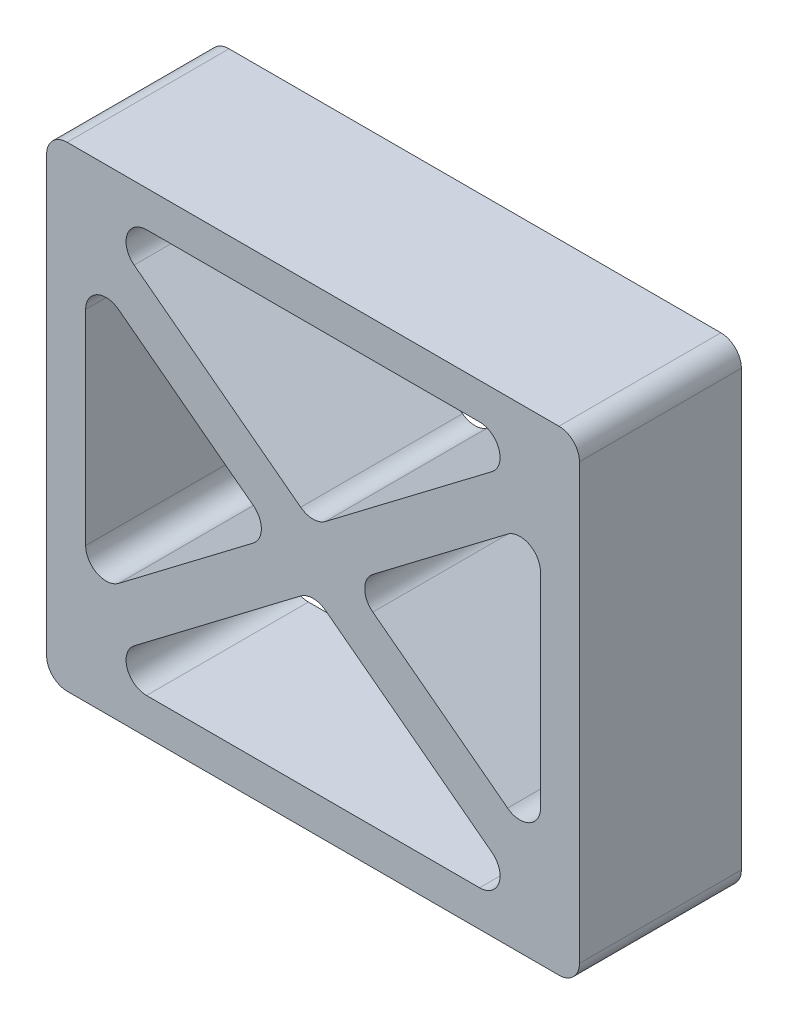
ISO-10303-21;
HEADER;
FILE_DESCRIPTION(('STEP AP214'),'2;1');
FILE_NAME('part.step','',(''),(''),'','','');
FILE_SCHEMA(('AUTOMOTIVE_DESIGN { 1 0 10303 214 1 1 1 1 }'));
ENDSEC;
DATA;
#1=APPLICATION_CONTEXT('core data for automotive mechanical design processes');
#2=APPLICATION_PROTOCOL_DEFINITION('international standard','automotive_design',2000,#1);
#3=PRODUCT_CONTEXT('',#1,'mechanical');
#4=PRODUCT('Part','Part','',(#3));
#5=PRODUCT_RELATED_PRODUCT_CATEGORY('part','',(#4));
#6=PRODUCT_DEFINITION_FORMATION('','',#4);
#7=PRODUCT_DEFINITION_CONTEXT('part definition',#1,'design');
#8=PRODUCT_DEFINITION('design','',#6,#7);
#9=PRODUCT_DEFINITION_SHAPE('','',#8);
#10=(LENGTH_UNIT() NAMED_UNIT(*) SI_UNIT(.MILLI.,.METRE.));
#11=(NAMED_UNIT(*) PLANE_ANGLE_UNIT() SI_UNIT($,.RADIAN.));
#12=(NAMED_UNIT(*) SI_UNIT($,.STERADIAN.) SOLID_ANGLE_UNIT());
#13=UNCERTAINTY_MEASURE_WITH_UNIT(LENGTH_MEASURE(1.E-05),#10,'distance_accuracy_value','');
#14=(GEOMETRIC_REPRESENTATION_CONTEXT(3) GLOBAL_UNCERTAINTY_ASSIGNED_CONTEXT((#13)) GLOBAL_UNIT_ASSIGNED_CONTEXT((#10,
#11,#12)) REPRESENTATION_CONTEXT('',''));
#15=CARTESIAN_POINT('',(0.,0.,0.));
#16=DIRECTION('',(0.,0.,1.));
#17=DIRECTION('',(1.,0.,0.));
#18=AXIS2_PLACEMENT_3D('',#15,#16,#17);
#19=CARTESIAN_POINT('',(-54.4164453565105,45.1223241590214,39.5));
#20=DIRECTION('',(1.,0.,0.));
#21=DIRECTION('',(0.,1.,0.));
#22=AXIS2_PLACEMENT_3D('',#19,#20,#21);
#23=PLANE('',#22);
#24=DIRECTION('',(0.,-1.,0.));
#25=VECTOR('',#24,1.);
#26=CARTESIAN_POINT('',(-54.4164453565105,45.1223241590214,0.));
#27=LINE('',#26,#25);
#28=CARTESIAN_POINT('',(-54.4164453565105,40.1223241590214,0.));
#29=VERTEX_POINT('',#28);
#30=CARTESIAN_POINT('',(-54.4164453565105,-65.8776758409786,0.));
#31=VERTEX_POINT('',#30);
#32=EDGE_CURVE('E315',#29,#31,#27,.T.);
#33=ORIENTED_EDGE('',*,*,#32,.T.);
#34=DIRECTION('',(0.,0.,-1.));
#35=VECTOR('',#34,1.);
#36=CARTESIAN_POINT('',(-54.4164453565105,-65.8776758409786,39.5));
#37=LINE('',#36,#35);
#38=CARTESIAN_POINT('',(-54.4164453565105,-65.8776758409786,39.5));
#39=VERTEX_POINT('',#38);
#40=EDGE_CURVE('E424',#31,#39,#37,.F.);
#41=ORIENTED_EDGE('',*,*,#40,.T.);
#42=DIRECTION('',(0.,-1.,0.));
#43=VECTOR('',#42,1.);
#44=CARTESIAN_POINT('',(-54.4164453565105,45.1223241590214,39.5));
#45=LINE('',#44,#43);
#46=CARTESIAN_POINT('',(-54.4164453565105,40.1223241590214,39.5));
#47=VERTEX_POINT('',#46);
#48=EDGE_CURVE('E323',#47,#39,#45,.T.);
#49=ORIENTED_EDGE('',*,*,#48,.F.);
#50=DIRECTION('',(0.,0.,-1.));
#51=VECTOR('',#50,1.);
#52=CARTESIAN_POINT('',(-54.4164453565105,40.1223241590214,39.5));
#53=LINE('',#52,#51);
#54=EDGE_CURVE('E421',#47,#29,#53,.T.);
#55=ORIENTED_EDGE('',*,*,#54,.T.);
#56=EDGE_LOOP('',(#33,#41,#49,#55));
#57=FACE_BOUND('',#56,.T.);
#58=ADVANCED_FACE('F38',(#57),#23,.F.);
#59=CARTESIAN_POINT('',(-54.4164453565105,-70.8776758409786,39.5));
#60=DIRECTION('',(0.,1.,0.));
#61=DIRECTION('',(0.,0.,1.));
#62=AXIS2_PLACEMENT_3D('',#59,#60,#61);
#63=PLANE('',#62);
#64=DIRECTION('',(1.,0.,0.));
#65=VECTOR('',#64,1.);
#66=CARTESIAN_POINT('',(-54.4164453565105,-70.8776758409786,0.));
#67=LINE('',#66,#65);
#68=CARTESIAN_POINT('',(-49.4164453565105,-70.8776758409786,0.));
#69=VERTEX_POINT('',#68);
#70=CARTESIAN_POINT('',(70.5835546434895,-70.8776758409786,0.));
#71=VERTEX_POINT('',#70);
#72=EDGE_CURVE('E336',#69,#71,#67,.T.);
#73=ORIENTED_EDGE('',*,*,#72,.T.);
#74=DIRECTION('',(0.,0.,-1.));
#75=VECTOR('',#74,1.);
#76=CARTESIAN_POINT('',(70.5835546434895,-70.8776758409786,39.5));
#77=LINE('',#76,#75);
#78=CARTESIAN_POINT('',(70.5835546434895,-70.8776758409786,39.5));
#79=VERTEX_POINT('',#78);
#80=EDGE_CURVE('E53',#71,#79,#77,.F.);
#81=ORIENTED_EDGE('',*,*,#80,.T.);
#82=DIRECTION('',(1.,0.,0.));
#83=VECTOR('',#82,1.);
#84=CARTESIAN_POINT('',(-54.4164453565105,-70.8776758409786,39.5));
#85=LINE('',#84,#83);
#86=CARTESIAN_POINT('',(-49.4164453565105,-70.8776758409786,39.5));
#87=VERTEX_POINT('',#86);
#88=EDGE_CURVE('E325',#87,#79,#85,.T.);
#89=ORIENTED_EDGE('',*,*,#88,.F.);
#90=DIRECTION('',(0.,0.,-1.));
#91=VECTOR('',#90,1.);
#92=CARTESIAN_POINT('',(-49.4164453565105,-70.8776758409786,39.5));
#93=LINE('',#92,#91);
#94=EDGE_CURVE('E417',#87,#69,#93,.T.);
#95=ORIENTED_EDGE('',*,*,#94,.T.);
#96=EDGE_LOOP('',(#73,#81,#89,#95));
#97=FACE_BOUND('',#96,.T.);
#98=ADVANCED_FACE('F509',(#97),#63,.F.);
#99=CARTESIAN_POINT('',(75.5835546434894,45.1223241590214,39.5));
#100=DIRECTION('',(-1.,0.,0.));
#101=DIRECTION('',(0.,-1.,0.));
#102=AXIS2_PLACEMENT_3D('',#99,#100,#101);
#103=PLANE('',#102);
#104=DIRECTION('',(0.,1.,0.));
#105=VECTOR('',#104,1.);
#106=CARTESIAN_POINT('',(75.5835546434894,45.1223241590214,0.));
#107=LINE('',#106,#105);
#108=CARTESIAN_POINT('',(75.5835546434895,-65.8776758409786,0.));
#109=VERTEX_POINT('',#108);
#110=CARTESIAN_POINT('',(75.5835546434894,40.1223241590214,0.));
#111=VERTEX_POINT('',#110);
#112=EDGE_CURVE('E338',#109,#111,#107,.T.);
#113=ORIENTED_EDGE('',*,*,#112,.T.);
#114=DIRECTION('',(0.,0.,-1.));
#115=VECTOR('',#114,1.);
#116=CARTESIAN_POINT('',(75.5835546434894,40.1223241590214,39.5));
#117=LINE('',#116,#115);
#118=CARTESIAN_POINT('',(75.5835546434894,40.1223241590214,39.5));
#119=VERTEX_POINT('',#118);
#120=EDGE_CURVE('E408',#111,#119,#117,.F.);
#121=ORIENTED_EDGE('',*,*,#120,.T.);
#122=DIRECTION('',(0.,1.,0.));
#123=VECTOR('',#122,1.);
#124=CARTESIAN_POINT('',(75.5835546434894,45.1223241590214,39.5));
#125=LINE('',#124,#123);
#126=CARTESIAN_POINT('',(75.5835546434895,-65.8776758409786,39.5));
#127=VERTEX_POINT('',#126);
#128=EDGE_CURVE('E328',#127,#119,#125,.T.);
#129=ORIENTED_EDGE('',*,*,#128,.F.);
#130=DIRECTION('',(0.,0.,-1.));
#131=VECTOR('',#130,1.);
#132=CARTESIAN_POINT('',(75.5835546434895,-65.8776758409786,39.5));
#133=LINE('',#132,#131);
#134=EDGE_CURVE('E405',#127,#109,#133,.T.);
#135=ORIENTED_EDGE('',*,*,#134,.T.);
#136=EDGE_LOOP('',(#113,#121,#129,#135));
#137=FACE_BOUND('',#136,.T.);
#138=ADVANCED_FACE('F515',(#137),#103,.F.);
#139=CARTESIAN_POINT('',(-54.4164453565105,45.1223241590214,39.5));
#140=DIRECTION('',(0.,-1.,0.));
#141=DIRECTION('',(0.,0.,-1.));
#142=AXIS2_PLACEMENT_3D('',#139,#140,#141);
#143=PLANE('',#142);
#144=DIRECTION('',(-1.,0.,0.));
#145=VECTOR('',#144,1.);
#146=CARTESIAN_POINT('',(-54.4164453565105,45.1223241590214,39.5));
#147=LINE('',#146,#145);
#148=CARTESIAN_POINT('',(70.5835546434894,45.1223241590214,39.5));
#149=VERTEX_POINT('',#148);
#150=CARTESIAN_POINT('',(-49.4164453565105,45.1223241590214,39.5));
#151=VERTEX_POINT('',#150);
#152=EDGE_CURVE('E331',#149,#151,#147,.T.);
#153=ORIENTED_EDGE('',*,*,#152,.F.);
#154=DIRECTION('',(0.,0.,-1.));
#155=VECTOR('',#154,1.);
#156=CARTESIAN_POINT('',(70.5835546434894,45.1223241590214,39.5));
#157=LINE('',#156,#155);
#158=CARTESIAN_POINT('',(70.5835546434894,45.1223241590214,0.));
#159=VERTEX_POINT('',#158);
#160=EDGE_CURVE('E394',#149,#159,#157,.T.);
#161=ORIENTED_EDGE('',*,*,#160,.T.);
#162=DIRECTION('',(-1.,0.,0.));
#163=VECTOR('',#162,1.);
#164=CARTESIAN_POINT('',(-54.4164453565105,45.1223241590214,0.));
#165=LINE('',#164,#163);
#166=CARTESIAN_POINT('',(-49.4164453565105,45.1223241590214,0.));
#167=VERTEX_POINT('',#166);
#168=EDGE_CURVE('E326',#159,#167,#165,.T.);
#169=ORIENTED_EDGE('',*,*,#168,.T.);
#170=DIRECTION('',(0.,0.,-1.));
#171=VECTOR('',#170,1.);
#172=CARTESIAN_POINT('',(-49.4164453565105,45.1223241590214,39.5));
#173=LINE('',#172,#171);
#174=EDGE_CURVE('E392',#167,#151,#173,.F.);
#175=ORIENTED_EDGE('',*,*,#174,.T.);
#176=EDGE_LOOP('',(#153,#161,#169,#175));
#177=FACE_BOUND('',#176,.T.);
#178=ADVANCED_FACE('F583',(#177),#143,.F.);
#179=CARTESIAN_POINT('',(0.,0.,39.5));
#180=DIRECTION('',(0.,0.,1.));
#181=DIRECTION('',(1.,0.,0.));
#182=AXIS2_PLACEMENT_3D('',#179,#180,#181);
#183=PLANE('',#182);
#184=DIRECTION('',(1.,0.,0.));
#185=VECTOR('',#184,1.);
#186=CARTESIAN_POINT('',(66.0688913812574,-62.0866449810001,39.5));
#187=LINE('',#186,#185);
#188=CARTESIAN_POINT('',(-30.0463876718341,-62.0866449810001,39.5));
#189=VERTEX_POINT('',#188);
#190=CARTESIAN_POINT('',(51.213496958813,-62.0866449810001,39.5));
#191=VERTEX_POINT('',#190);
#192=EDGE_CURVE('E666',#189,#191,#187,.T.);
#193=ORIENTED_EDGE('',*,*,#192,.F.);
#194=CARTESIAN_POINT('',(-30.0463876718341,-57.0866449810001,39.5));
#195=DIRECTION('',(0.,0.,1.));
#196=DIRECTION('',(1.,0.,0.));
#197=AXIS2_PLACEMENT_3D('',#194,#195,#196);
#198=CIRCLE('',#197,5.);
#199=CARTESIAN_POINT('',(-33.0696757982315,-53.1042174669347,39.5));
#200=VERTEX_POINT('',#199);
#201=EDGE_CURVE('E442',#189,#200,#198,.F.);
#202=ORIENTED_EDGE('',*,*,#201,.T.);
#203=DIRECTION('',(-0.796485502813062,-0.604657625279483,0.));
#204=VECTOR('',#203,1.);
#205=CARTESIAN_POINT('',(-44.9017820942785,-62.0866449810001,39.5));
#206=LINE('',#205,#204);
#207=CARTESIAN_POINT('',(7.56026651709206,-22.2597082462918,39.5));
#208=VERTEX_POINT('',#207);
#209=EDGE_CURVE('E642',#208,#200,#206,.T.);
#210=ORIENTED_EDGE('',*,*,#209,.F.);
#211=CARTESIAN_POINT('',(10.5835546434895,-26.2421357603571,39.5));
#212=DIRECTION('',(0.,0.,1.));
#213=DIRECTION('',(1.,0.,0.));
#214=AXIS2_PLACEMENT_3D('',#211,#212,#213);
#215=CIRCLE('',#214,5.);
#216=CARTESIAN_POINT('',(13.6068427698869,-22.2597082462918,39.5));
#217=VERTEX_POINT('',#216);
#218=EDGE_CURVE('E446',#208,#217,#215,.F.);
#219=ORIENTED_EDGE('',*,*,#218,.T.);
#220=DIRECTION('',(-0.796485502813062,0.604657625279483,0.));
#221=VECTOR('',#220,1.);
#222=CARTESIAN_POINT('',(10.5835546434894,-19.9645575968617,39.5));
#223=LINE('',#222,#221);
#224=CARTESIAN_POINT('',(54.2367850852104,-53.1042174669347,39.5));
#225=VERTEX_POINT('',#224);
#226=EDGE_CURVE('E648',#225,#217,#223,.T.);
#227=ORIENTED_EDGE('',*,*,#226,.F.);
#228=CARTESIAN_POINT('',(51.213496958813,-57.086644981,39.5));
#229=DIRECTION('',(0.,0.,1.));
#230=DIRECTION('',(1.,0.,0.));
#231=AXIS2_PLACEMENT_3D('',#228,#229,#230);
#232=CIRCLE('',#231,5.);
#233=EDGE_CURVE('E438',#225,#191,#232,.F.);
#234=ORIENTED_EDGE('',*,*,#233,.T.);
#235=EDGE_LOOP('',(#193,#202,#210,#219,#227,#234));
#236=FACE_BOUND('',#235,.T.);
#237=DIRECTION('',(0.796485502813062,-0.604657625279483,0.));
#238=VECTOR('',#237,1.);
#239=CARTESIAN_POINT('',(66.0688913812574,-47.9128814692339,39.5));
#240=LINE('',#239,#238);
#241=CARTESIAN_POINT('',(25.1646067812062,-16.8601033550439,39.5));
#242=VERTEX_POINT('',#241);
#243=CARTESIAN_POINT('',(58.04560325486,-41.8219453149582,39.5));
#244=VERTEX_POINT('',#243);
#245=EDGE_CURVE('E282',#242,#244,#240,.T.);
#246=ORIENTED_EDGE('',*,*,#245,.F.);
#247=CARTESIAN_POINT('',(28.1878949076036,-12.8776758409786,39.5));
#248=DIRECTION('',(0.,0.,1.));
#249=DIRECTION('',(1.,0.,0.));
#250=AXIS2_PLACEMENT_3D('',#247,#248,#249);
#251=CIRCLE('',#250,5.);
#252=CARTESIAN_POINT('',(25.1646067812062,-8.89524832691325,39.5));
#253=VERTEX_POINT('',#252);
#254=EDGE_CURVE('E275',#242,#253,#251,.F.);
#255=ORIENTED_EDGE('',*,*,#254,.T.);
#256=DIRECTION('',(-0.796485502813062,-0.604657625279483,0.));
#257=VECTOR('',#256,1.);
#258=CARTESIAN_POINT('',(19.9187525186543,-12.8776758409786,39.5));
#259=LINE('',#258,#257);
#260=CARTESIAN_POINT('',(58.04560325486,16.0665936330011,39.5));
#261=VERTEX_POINT('',#260);
#262=EDGE_CURVE('E265',#261,#253,#259,.T.);
#263=ORIENTED_EDGE('',*,*,#262,.F.);
#264=CARTESIAN_POINT('',(61.0688913812574,12.0841661189357,39.5));
#265=DIRECTION('',(0.,0.,1.));
#266=DIRECTION('',(1.,0.,0.));
#267=AXIS2_PLACEMENT_3D('',#264,#265,#266);
#268=CIRCLE('',#267,5.);
#269=CARTESIAN_POINT('',(66.0688913812574,12.0841661189357,39.5));
#270=VERTEX_POINT('',#269);
#271=EDGE_CURVE('E248',#261,#270,#268,.F.);
#272=ORIENTED_EDGE('',*,*,#271,.T.);
#273=DIRECTION('',(0.,1.,0.));
#274=VECTOR('',#273,1.);
#275=CARTESIAN_POINT('',(66.0688913812574,22.1575297872767,39.5));
#276=LINE('',#275,#274);
#277=CARTESIAN_POINT('',(66.0688913812574,-37.8395178008929,39.5));
#278=VERTEX_POINT('',#277);
#279=EDGE_CURVE('E277',#278,#270,#276,.T.);
#280=ORIENTED_EDGE('',*,*,#279,.F.);
#281=CARTESIAN_POINT('',(61.0688913812574,-37.8395178008929,39.5));
#282=DIRECTION('',(0.,0.,1.));
#283=DIRECTION('',(1.,0.,0.));
#284=AXIS2_PLACEMENT_3D('',#281,#282,#283);
#285=CIRCLE('',#284,5.);
#286=EDGE_CURVE('E434',#278,#244,#285,.F.);
#287=ORIENTED_EDGE('',*,*,#286,.T.);
#288=EDGE_LOOP('',(#246,#255,#263,#272,#280,#287));
#289=FACE_BOUND('',#288,.T.);
#290=DIRECTION('',(-0.796485502813062,0.604657625279483,0.));
#291=VECTOR('',#290,1.);
#292=CARTESIAN_POINT('',(1.24835676832459,-12.8776758409786,39.5));
#293=LINE('',#292,#291);
#294=CARTESIAN_POINT('',(-3.9974974942273,-8.89524832691327,39.5));
#295=VERTEX_POINT('',#294);
#296=CARTESIAN_POINT('',(-36.8784939678811,16.0665936330011,39.5));
#297=VERTEX_POINT('',#296);
#298=EDGE_CURVE('E297',#295,#297,#293,.T.);
#299=ORIENTED_EDGE('',*,*,#298,.F.);
#300=CARTESIAN_POINT('',(-7.02078562062472,-12.8776758409786,39.5));
#301=DIRECTION('',(0.,0.,1.));
#302=DIRECTION('',(1.,0.,0.));
#303=AXIS2_PLACEMENT_3D('',#300,#301,#302);
#304=CIRCLE('',#303,5.);
#305=CARTESIAN_POINT('',(-3.9974974942273,-16.8601033550439,39.5));
#306=VERTEX_POINT('',#305);
#307=EDGE_CURVE('E450',#295,#306,#304,.F.);
#308=ORIENTED_EDGE('',*,*,#307,.T.);
#309=DIRECTION('',(0.796485502813062,0.604657625279483,0.));
#310=VECTOR('',#309,1.);
#311=CARTESIAN_POINT('',(-44.9017820942785,-47.9128814692339,39.5));
#312=LINE('',#311,#310);
#313=CARTESIAN_POINT('',(-36.8784939678811,-41.8219453149582,39.5));
#314=VERTEX_POINT('',#313);
#315=EDGE_CURVE('E290',#314,#306,#312,.T.);
#316=ORIENTED_EDGE('',*,*,#315,.F.);
#317=CARTESIAN_POINT('',(-39.9017820942785,-37.8395178008929,39.5));
#318=DIRECTION('',(0.,0.,1.));
#319=DIRECTION('',(1.,0.,0.));
#320=AXIS2_PLACEMENT_3D('',#317,#318,#319);
#321=CIRCLE('',#320,5.);
#322=CARTESIAN_POINT('',(-44.9017820942785,-37.8395178008929,39.5));
#323=VERTEX_POINT('',#322);
#324=EDGE_CURVE('E454',#314,#323,#321,.F.);
#325=ORIENTED_EDGE('',*,*,#324,.T.);
#326=DIRECTION('',(0.,-1.,0.));
#327=VECTOR('',#326,1.);
#328=CARTESIAN_POINT('',(-44.9017820942785,22.1575297872767,39.5));
#329=LINE('',#328,#327);
#330=CARTESIAN_POINT('',(-44.9017820942785,12.0841661189357,39.5));
#331=VERTEX_POINT('',#330);
#332=EDGE_CURVE('E300',#331,#323,#329,.T.);
#333=ORIENTED_EDGE('',*,*,#332,.F.);
#334=CARTESIAN_POINT('',(-39.9017820942785,12.0841661189357,39.5));
#335=DIRECTION('',(0.,0.,1.));
#336=DIRECTION('',(1.,0.,0.));
#337=AXIS2_PLACEMENT_3D('',#334,#335,#336);
#338=CIRCLE('',#337,5.);
#339=EDGE_CURVE('E462',#331,#297,#338,.F.);
#340=ORIENTED_EDGE('',*,*,#339,.T.);
#341=EDGE_LOOP('',(#299,#308,#316,#325,#333,#340));
#342=FACE_BOUND('',#341,.T.);
#343=DIRECTION('',(0.796485502813062,-0.604657625279483,0.));
#344=VECTOR('',#343,1.);
#345=CARTESIAN_POINT('',(10.5835546434895,-5.7907940850955,39.5));
#346=LINE('',#345,#344);
#347=CARTESIAN_POINT('',(-33.0696757982315,27.3488657849776,39.5));
#348=VERTEX_POINT('',#347);
#349=CARTESIAN_POINT('',(7.56026651709206,-3.49564343566533,39.5));
#350=VERTEX_POINT('',#349);
#351=EDGE_CURVE('E296',#348,#350,#346,.T.);
#352=ORIENTED_EDGE('',*,*,#351,.F.);
#353=CARTESIAN_POINT('',(-30.0463876718341,31.3312932990429,39.5));
#354=DIRECTION('',(0.,0.,1.));
#355=DIRECTION('',(1.,0.,0.));
#356=AXIS2_PLACEMENT_3D('',#353,#354,#355);
#357=CIRCLE('',#356,5.);
#358=CARTESIAN_POINT('',(-30.0463876718341,36.3312932990429,39.5));
#359=VERTEX_POINT('',#358);
#360=EDGE_CURVE('E46',#348,#359,#357,.F.);
#361=ORIENTED_EDGE('',*,*,#360,.T.);
#362=DIRECTION('',(-1.,0.,0.));
#363=VECTOR('',#362,1.);
#364=CARTESIAN_POINT('',(-44.9017820942785,36.3312932990429,39.5));
#365=LINE('',#364,#363);
#366=CARTESIAN_POINT('',(51.213496958813,36.3312932990429,39.5));
#367=VERTEX_POINT('',#366);
#368=EDGE_CURVE('E309',#367,#359,#365,.T.);
#369=ORIENTED_EDGE('',*,*,#368,.F.);
#370=CARTESIAN_POINT('',(51.213496958813,31.3312932990429,39.5));
#371=DIRECTION('',(0.,0.,1.));
#372=DIRECTION('',(1.,0.,0.));
#373=AXIS2_PLACEMENT_3D('',#370,#371,#372);
#374=CIRCLE('',#373,5.);
#375=CARTESIAN_POINT('',(54.2367850852104,27.3488657849776,39.5));
#376=VERTEX_POINT('',#375);
#377=EDGE_CURVE('E466',#367,#376,#374,.F.);
#378=ORIENTED_EDGE('',*,*,#377,.T.);
#379=DIRECTION('',(0.796485502813062,0.604657625279484,0.));
#380=VECTOR('',#379,1.);
#381=CARTESIAN_POINT('',(66.0688913812574,36.3312932990429,39.5));
#382=LINE('',#381,#380);
#383=CARTESIAN_POINT('',(13.6068427698869,-3.49564343566534,39.5));
#384=VERTEX_POINT('',#383);
#385=EDGE_CURVE('E318',#384,#376,#382,.T.);
#386=ORIENTED_EDGE('',*,*,#385,.F.);
#387=CARTESIAN_POINT('',(10.5835546434895,0.486784078399985,39.5));
#388=DIRECTION('',(0.,0.,1.));
#389=DIRECTION('',(1.,0.,0.));
#390=AXIS2_PLACEMENT_3D('',#387,#388,#389);
#391=CIRCLE('',#390,5.);
#392=EDGE_CURVE('E458',#384,#350,#391,.F.);
#393=ORIENTED_EDGE('',*,*,#392,.T.);
#394=EDGE_LOOP('',(#352,#361,#369,#378,#386,#393));
#395=FACE_BOUND('',#394,.T.);
#396=ORIENTED_EDGE('',*,*,#128,.T.);
#397=CARTESIAN_POINT('',(70.5835546434894,40.1223241590214,39.5));
#398=DIRECTION('',(0.,0.,1.));
#399=DIRECTION('',(1.,0.,0.));
#400=AXIS2_PLACEMENT_3D('',#397,#398,#399);
#401=CIRCLE('',#400,5.);
#402=EDGE_CURVE('E415',#119,#149,#401,.T.);
#403=ORIENTED_EDGE('',*,*,#402,.T.);
#404=ORIENTED_EDGE('',*,*,#152,.T.);
#405=CARTESIAN_POINT('',(-49.4164453565105,40.1223241590214,39.5));
#406=DIRECTION('',(0.,0.,1.));
#407=DIRECTION('',(1.,0.,0.));
#408=AXIS2_PLACEMENT_3D('',#405,#406,#407);
#409=CIRCLE('',#408,5.);
#410=EDGE_CURVE('E410',#151,#47,#409,.T.);
#411=ORIENTED_EDGE('',*,*,#410,.T.);
#412=ORIENTED_EDGE('',*,*,#48,.T.);
#413=CARTESIAN_POINT('',(-49.4164453565105,-65.8776758409786,39.5));
#414=DIRECTION('',(0.,0.,1.));
#415=DIRECTION('',(1.,0.,0.));
#416=AXIS2_PLACEMENT_3D('',#413,#414,#415);
#417=CIRCLE('',#416,5.);
#418=EDGE_CURVE('E60',#39,#87,#417,.T.);
#419=ORIENTED_EDGE('',*,*,#418,.T.);
#420=ORIENTED_EDGE('',*,*,#88,.T.);
#421=CARTESIAN_POINT('',(70.5835546434895,-65.8776758409786,39.5));
#422=DIRECTION('',(0.,0.,1.));
#423=DIRECTION('',(1.,0.,0.));
#424=AXIS2_PLACEMENT_3D('',#421,#422,#423);
#425=CIRCLE('',#424,5.);
#426=EDGE_CURVE('E413',#79,#127,#425,.T.);
#427=ORIENTED_EDGE('',*,*,#426,.T.);
#428=EDGE_LOOP('',(#396,#403,#404,#411,#412,#419,#420,#427));
#429=FACE_BOUND('',#428,.T.);
#430=ADVANCED_FACE('F273',(#236,#289,#342,#395,#429),#183,.T.);
#431=CARTESIAN_POINT('',(0.,0.,0.));
#432=DIRECTION('',(0.,0.,1.));
#433=DIRECTION('',(1.,0.,0.));
#434=AXIS2_PLACEMENT_3D('',#431,#432,#433);
#435=PLANE('',#434);
#436=DIRECTION('',(-0.796485502813062,0.604657625279483,0.));
#437=VECTOR('',#436,1.);
#438=CARTESIAN_POINT('',(10.5835546434894,-19.9645575968617,0.));
#439=LINE('',#438,#437);
#440=CARTESIAN_POINT('',(54.2367850852104,-53.1042174669347,0.));
#441=VERTEX_POINT('',#440);
#442=CARTESIAN_POINT('',(13.6068427698869,-22.2597082462918,0.));
#443=VERTEX_POINT('',#442);
#444=EDGE_CURVE('E661',#441,#443,#439,.T.);
#445=ORIENTED_EDGE('',*,*,#444,.T.);
#446=CARTESIAN_POINT('',(10.5835546434895,-26.2421357603571,0.));
#447=DIRECTION('',(0.,0.,1.));
#448=DIRECTION('',(1.,0.,0.));
#449=AXIS2_PLACEMENT_3D('',#446,#447,#448);
#450=CIRCLE('',#449,5.);
#451=CARTESIAN_POINT('',(7.56026651709206,-22.2597082462918,0.));
#452=VERTEX_POINT('',#451);
#453=EDGE_CURVE('E448',#443,#452,#450,.T.);
#454=ORIENTED_EDGE('',*,*,#453,.T.);
#455=DIRECTION('',(-0.796485502813062,-0.604657625279483,0.));
#456=VECTOR('',#455,1.);
#457=CARTESIAN_POINT('',(-44.9017820942785,-62.0866449810001,0.));
#458=LINE('',#457,#456);
#459=CARTESIAN_POINT('',(-33.0696757982315,-53.1042174669347,0.));
#460=VERTEX_POINT('',#459);
#461=EDGE_CURVE('E657',#452,#460,#458,.T.);
#462=ORIENTED_EDGE('',*,*,#461,.T.);
#463=CARTESIAN_POINT('',(-30.0463876718341,-57.0866449810001,0.));
#464=DIRECTION('',(0.,0.,1.));
#465=DIRECTION('',(1.,0.,0.));
#466=AXIS2_PLACEMENT_3D('',#463,#464,#465);
#467=CIRCLE('',#466,5.);
#468=CARTESIAN_POINT('',(-30.0463876718341,-62.0866449810001,0.));
#469=VERTEX_POINT('',#468);
#470=EDGE_CURVE('E444',#460,#469,#467,.T.);
#471=ORIENTED_EDGE('',*,*,#470,.T.);
#472=DIRECTION('',(1.,0.,0.));
#473=VECTOR('',#472,1.);
#474=CARTESIAN_POINT('',(66.0688913812574,-62.0866449810001,0.));
#475=LINE('',#474,#473);
#476=CARTESIAN_POINT('',(51.213496958813,-62.0866449810001,0.));
#477=VERTEX_POINT('',#476);
#478=EDGE_CURVE('E647',#469,#477,#475,.T.);
#479=ORIENTED_EDGE('',*,*,#478,.T.);
#480=CARTESIAN_POINT('',(51.213496958813,-57.086644981,0.));
#481=DIRECTION('',(0.,0.,1.));
#482=DIRECTION('',(1.,0.,0.));
#483=AXIS2_PLACEMENT_3D('',#480,#481,#482);
#484=CIRCLE('',#483,5.);
#485=EDGE_CURVE('E440',#477,#441,#484,.T.);
#486=ORIENTED_EDGE('',*,*,#485,.T.);
#487=EDGE_LOOP('',(#445,#454,#462,#471,#479,#486));
#488=FACE_BOUND('',#487,.T.);
#489=DIRECTION('',(0.,1.,0.));
#490=VECTOR('',#489,1.);
#491=CARTESIAN_POINT('',(66.0688913812574,22.1575297872767,0.));
#492=LINE('',#491,#490);
#493=CARTESIAN_POINT('',(66.0688913812574,-37.8395178008929,0.));
#494=VERTEX_POINT('',#493);
#495=CARTESIAN_POINT('',(66.0688913812574,12.0841661189357,0.));
#496=VERTEX_POINT('',#495);
#497=EDGE_CURVE('E280',#494,#496,#492,.T.);
#498=ORIENTED_EDGE('',*,*,#497,.T.);
#499=CARTESIAN_POINT('',(61.0688913812574,12.0841661189357,0.));
#500=DIRECTION('',(0.,0.,1.));
#501=DIRECTION('',(1.,0.,0.));
#502=AXIS2_PLACEMENT_3D('',#499,#500,#501);
#503=CIRCLE('',#502,5.);
#504=CARTESIAN_POINT('',(58.04560325486,16.0665936330011,0.));
#505=VERTEX_POINT('',#504);
#506=EDGE_CURVE('E258',#496,#505,#503,.T.);
#507=ORIENTED_EDGE('',*,*,#506,.T.);
#508=DIRECTION('',(-0.796485502813062,-0.604657625279483,0.));
#509=VECTOR('',#508,1.);
#510=CARTESIAN_POINT('',(19.9187525186543,-12.8776758409786,0.));
#511=LINE('',#510,#509);
#512=CARTESIAN_POINT('',(25.1646067812062,-8.89524832691325,0.));
#513=VERTEX_POINT('',#512);
#514=EDGE_CURVE('E268',#505,#513,#511,.T.);
#515=ORIENTED_EDGE('',*,*,#514,.T.);
#516=CARTESIAN_POINT('',(28.1878949076036,-12.8776758409786,0.));
#517=DIRECTION('',(0.,0.,1.));
#518=DIRECTION('',(1.,0.,0.));
#519=AXIS2_PLACEMENT_3D('',#516,#517,#518);
#520=CIRCLE('',#519,5.);
#521=CARTESIAN_POINT('',(25.1646067812062,-16.8601033550439,0.));
#522=VERTEX_POINT('',#521);
#523=EDGE_CURVE('E432',#513,#522,#520,.T.);
#524=ORIENTED_EDGE('',*,*,#523,.T.);
#525=DIRECTION('',(0.796485502813062,-0.604657625279483,0.));
#526=VECTOR('',#525,1.);
#527=CARTESIAN_POINT('',(66.0688913812574,-47.9128814692339,0.));
#528=LINE('',#527,#526);
#529=CARTESIAN_POINT('',(58.04560325486,-41.8219453149582,0.));
#530=VERTEX_POINT('',#529);
#531=EDGE_CURVE('E276',#522,#530,#528,.T.);
#532=ORIENTED_EDGE('',*,*,#531,.T.);
#533=CARTESIAN_POINT('',(61.0688913812574,-37.8395178008929,0.));
#534=DIRECTION('',(0.,0.,1.));
#535=DIRECTION('',(1.,0.,0.));
#536=AXIS2_PLACEMENT_3D('',#533,#534,#535);
#537=CIRCLE('',#536,5.);
#538=EDGE_CURVE('E436',#530,#494,#537,.T.);
#539=ORIENTED_EDGE('',*,*,#538,.T.);
#540=EDGE_LOOP('',(#498,#507,#515,#524,#532,#539));
#541=FACE_BOUND('',#540,.T.);
#542=DIRECTION('',(0.,-1.,0.));
#543=VECTOR('',#542,1.);
#544=CARTESIAN_POINT('',(-44.9017820942785,22.1575297872767,0.));
#545=LINE('',#544,#543);
#546=CARTESIAN_POINT('',(-44.9017820942785,12.0841661189357,0.));
#547=VERTEX_POINT('',#546);
#548=CARTESIAN_POINT('',(-44.9017820942785,-37.8395178008929,0.));
#549=VERTEX_POINT('',#548);
#550=EDGE_CURVE('E289',#547,#549,#545,.T.);
#551=ORIENTED_EDGE('',*,*,#550,.T.);
#552=CARTESIAN_POINT('',(-39.9017820942785,-37.8395178008929,0.));
#553=DIRECTION('',(0.,0.,1.));
#554=DIRECTION('',(1.,0.,0.));
#555=AXIS2_PLACEMENT_3D('',#552,#553,#554);
#556=CIRCLE('',#555,5.);
#557=CARTESIAN_POINT('',(-36.8784939678811,-41.8219453149582,0.));
#558=VERTEX_POINT('',#557);
#559=EDGE_CURVE('E456',#549,#558,#556,.T.);
#560=ORIENTED_EDGE('',*,*,#559,.T.);
#561=DIRECTION('',(0.796485502813062,0.604657625279483,0.));
#562=VECTOR('',#561,1.);
#563=CARTESIAN_POINT('',(-44.9017820942785,-47.9128814692339,0.));
#564=LINE('',#563,#562);
#565=CARTESIAN_POINT('',(-3.9974974942273,-16.8601033550439,0.));
#566=VERTEX_POINT('',#565);
#567=EDGE_CURVE('E293',#558,#566,#564,.T.);
#568=ORIENTED_EDGE('',*,*,#567,.T.);
#569=CARTESIAN_POINT('',(-7.02078562062472,-12.8776758409786,0.));
#570=DIRECTION('',(0.,0.,1.));
#571=DIRECTION('',(1.,0.,0.));
#572=AXIS2_PLACEMENT_3D('',#569,#570,#571);
#573=CIRCLE('',#572,5.);
#574=CARTESIAN_POINT('',(-3.9974974942273,-8.89524832691327,0.));
#575=VERTEX_POINT('',#574);
#576=EDGE_CURVE('E452',#566,#575,#573,.T.);
#577=ORIENTED_EDGE('',*,*,#576,.T.);
#578=DIRECTION('',(-0.796485502813062,0.604657625279483,0.));
#579=VECTOR('',#578,1.);
#580=CARTESIAN_POINT('',(1.24835676832459,-12.8776758409786,0.));
#581=LINE('',#580,#579);
#582=CARTESIAN_POINT('',(-36.8784939678811,16.0665936330011,0.));
#583=VERTEX_POINT('',#582);
#584=EDGE_CURVE('E286',#575,#583,#581,.T.);
#585=ORIENTED_EDGE('',*,*,#584,.T.);
#586=CARTESIAN_POINT('',(-39.9017820942785,12.0841661189357,0.));
#587=DIRECTION('',(0.,0.,1.));
#588=DIRECTION('',(1.,0.,0.));
#589=AXIS2_PLACEMENT_3D('',#586,#587,#588);
#590=CIRCLE('',#589,5.);
#591=EDGE_CURVE('E464',#583,#547,#590,.T.);
#592=ORIENTED_EDGE('',*,*,#591,.T.);
#593=EDGE_LOOP('',(#551,#560,#568,#577,#585,#592));
#594=FACE_BOUND('',#593,.T.);
#595=DIRECTION('',(0.796485502813062,0.604657625279484,0.));
#596=VECTOR('',#595,1.);
#597=CARTESIAN_POINT('',(66.0688913812574,36.3312932990429,0.));
#598=LINE('',#597,#596);
#599=CARTESIAN_POINT('',(13.6068427698869,-3.49564343566534,0.));
#600=VERTEX_POINT('',#599);
#601=CARTESIAN_POINT('',(54.2367850852104,27.3488657849776,0.));
#602=VERTEX_POINT('',#601);
#603=EDGE_CURVE('E308',#600,#602,#598,.T.);
#604=ORIENTED_EDGE('',*,*,#603,.T.);
#605=CARTESIAN_POINT('',(51.213496958813,31.3312932990429,0.));
#606=DIRECTION('',(0.,0.,1.));
#607=DIRECTION('',(1.,0.,0.));
#608=AXIS2_PLACEMENT_3D('',#605,#606,#607);
#609=CIRCLE('',#608,5.);
#610=CARTESIAN_POINT('',(51.213496958813,36.3312932990429,0.));
#611=VERTEX_POINT('',#610);
#612=EDGE_CURVE('E468',#602,#611,#609,.T.);
#613=ORIENTED_EDGE('',*,*,#612,.T.);
#614=DIRECTION('',(-1.,0.,0.));
#615=VECTOR('',#614,1.);
#616=CARTESIAN_POINT('',(-44.9017820942785,36.3312932990429,0.));
#617=LINE('',#616,#615);
#618=CARTESIAN_POINT('',(-30.0463876718341,36.3312932990429,0.));
#619=VERTEX_POINT('',#618);
#620=EDGE_CURVE('E312',#611,#619,#617,.T.);
#621=ORIENTED_EDGE('',*,*,#620,.T.);
#622=CARTESIAN_POINT('',(-30.0463876718341,31.3312932990429,0.));
#623=DIRECTION('',(0.,0.,1.));
#624=DIRECTION('',(1.,0.,0.));
#625=AXIS2_PLACEMENT_3D('',#622,#623,#624);
#626=CIRCLE('',#625,5.);
#627=CARTESIAN_POINT('',(-33.0696757982315,27.3488657849776,0.));
#628=VERTEX_POINT('',#627);
#629=EDGE_CURVE('E11',#619,#628,#626,.T.);
#630=ORIENTED_EDGE('',*,*,#629,.T.);
#631=DIRECTION('',(0.796485502813062,-0.604657625279483,0.));
#632=VECTOR('',#631,1.);
#633=CARTESIAN_POINT('',(10.5835546434895,-5.7907940850955,0.));
#634=LINE('',#633,#632);
#635=CARTESIAN_POINT('',(7.56026651709206,-3.49564343566533,0.));
#636=VERTEX_POINT('',#635);
#637=EDGE_CURVE('E305',#628,#636,#634,.T.);
#638=ORIENTED_EDGE('',*,*,#637,.T.);
#639=CARTESIAN_POINT('',(10.5835546434895,0.486784078399985,0.));
#640=DIRECTION('',(0.,0.,1.));
#641=DIRECTION('',(1.,0.,0.));
#642=AXIS2_PLACEMENT_3D('',#639,#640,#641);
#643=CIRCLE('',#642,5.);
#644=EDGE_CURVE('E460',#636,#600,#643,.T.);
#645=ORIENTED_EDGE('',*,*,#644,.T.);
#646=EDGE_LOOP('',(#604,#613,#621,#630,#638,#645));
#647=FACE_BOUND('',#646,.T.);
#648=ORIENTED_EDGE('',*,*,#168,.F.);
#649=CARTESIAN_POINT('',(70.5835546434894,40.1223241590214,0.));
#650=DIRECTION('',(0.,0.,1.));
#651=DIRECTION('',(1.,0.,0.));
#652=AXIS2_PLACEMENT_3D('',#649,#650,#651);
#653=CIRCLE('',#652,5.);
#654=EDGE_CURVE('E403',#159,#111,#653,.F.);
#655=ORIENTED_EDGE('',*,*,#654,.T.);
#656=ORIENTED_EDGE('',*,*,#112,.F.);
#657=CARTESIAN_POINT('',(70.5835546434895,-65.8776758409786,0.));
#658=DIRECTION('',(0.,0.,1.));
#659=DIRECTION('',(1.,0.,0.));
#660=AXIS2_PLACEMENT_3D('',#657,#658,#659);
#661=CIRCLE('',#660,5.);
#662=EDGE_CURVE('E401',#109,#71,#661,.F.);
#663=ORIENTED_EDGE('',*,*,#662,.T.);
#664=ORIENTED_EDGE('',*,*,#72,.F.);
#665=CARTESIAN_POINT('',(-49.4164453565105,-65.8776758409786,0.));
#666=DIRECTION('',(0.,0.,1.));
#667=DIRECTION('',(1.,0.,0.));
#668=AXIS2_PLACEMENT_3D('',#665,#666,#667);
#669=CIRCLE('',#668,5.);
#670=EDGE_CURVE('E399',#69,#31,#669,.F.);
#671=ORIENTED_EDGE('',*,*,#670,.T.);
#672=ORIENTED_EDGE('',*,*,#32,.F.);
#673=CARTESIAN_POINT('',(-49.4164453565105,40.1223241590214,0.));
#674=DIRECTION('',(0.,0.,1.));
#675=DIRECTION('',(1.,0.,0.));
#676=AXIS2_PLACEMENT_3D('',#673,#674,#675);
#677=CIRCLE('',#676,5.);
#678=EDGE_CURVE('E397',#29,#167,#677,.F.);
#679=ORIENTED_EDGE('',*,*,#678,.T.);
#680=EDGE_LOOP('',(#648,#655,#656,#663,#664,#671,#672,#679));
#681=FACE_BOUND('',#680,.T.);
#682=ADVANCED_FACE('F482',(#488,#541,#594,#647,#681),#435,.F.);
#683=CARTESIAN_POINT('',(10.5835546434895,-5.7907940850955,0.));
#684=DIRECTION('',(-0.604657625279483,-0.796485502813062,0.));
#685=DIRECTION('',(0.796485502813062,-0.604657625279483,0.));
#686=AXIS2_PLACEMENT_3D('',#683,#684,#685);
#687=PLANE('',#686);
#688=ORIENTED_EDGE('',*,*,#351,.T.);
#689=DIRECTION('',(0.,0.,1.));
#690=VECTOR('',#689,1.);
#691=CARTESIAN_POINT('',(7.56026651709206,-3.49564343566533,0.));
#692=LINE('',#691,#690);
#693=EDGE_CURVE('E390',#350,#636,#692,.F.);
#694=ORIENTED_EDGE('',*,*,#693,.T.);
#695=ORIENTED_EDGE('',*,*,#637,.F.);
#696=DIRECTION('',(0.,0.,1.));
#697=VECTOR('',#696,1.);
#698=CARTESIAN_POINT('',(-33.0696757982315,27.3488657849776,39.5));
#699=LINE('',#698,#697);
#700=EDGE_CURVE('E387',#628,#348,#699,.T.);
#701=ORIENTED_EDGE('',*,*,#700,.T.);
#702=EDGE_LOOP('',(#688,#694,#695,#701));
#703=FACE_BOUND('',#702,.T.);
#704=ADVANCED_FACE('F486',(#703),#687,.F.);
#705=CARTESIAN_POINT('',(-44.9017820942785,36.3312932990429,0.));
#706=DIRECTION('',(0.,1.,0.));
#707=DIRECTION('',(0.,0.,1.));
#708=AXIS2_PLACEMENT_3D('',#705,#706,#707);
#709=PLANE('',#708);
#710=ORIENTED_EDGE('',*,*,#620,.F.);
#711=DIRECTION('',(0.,0.,1.));
#712=VECTOR('',#711,1.);
#713=CARTESIAN_POINT('',(51.213496958813,36.3312932990429,39.5));
#714=LINE('',#713,#712);
#715=EDGE_CURVE('E259',#611,#367,#714,.T.);
#716=ORIENTED_EDGE('',*,*,#715,.T.);
#717=ORIENTED_EDGE('',*,*,#368,.T.);
#718=DIRECTION('',(0.,0.,1.));
#719=VECTOR('',#718,1.);
#720=CARTESIAN_POINT('',(-30.0463876718341,36.3312932990429,0.));
#721=LINE('',#720,#719);
#722=EDGE_CURVE('E426',#359,#619,#721,.F.);
#723=ORIENTED_EDGE('',*,*,#722,.T.);
#724=EDGE_LOOP('',(#710,#716,#717,#723));
#725=FACE_BOUND('',#724,.T.);
#726=ADVANCED_FACE('F477',(#725),#709,.F.);
#727=CARTESIAN_POINT('',(66.0688913812574,36.3312932990429,0.));
#728=DIRECTION('',(0.604657625279483,-0.796485502813062,0.));
#729=DIRECTION('',(0.796485502813062,0.604657625279483,0.));
#730=AXIS2_PLACEMENT_3D('',#727,#728,#729);
#731=PLANE('',#730);
#732=ORIENTED_EDGE('',*,*,#603,.F.);
#733=DIRECTION('',(0.,0.,1.));
#734=VECTOR('',#733,1.);
#735=CARTESIAN_POINT('',(13.6068427698869,-3.49564343566532,39.5));
#736=LINE('',#735,#734);
#737=EDGE_CURVE('E384',#600,#384,#736,.T.);
#738=ORIENTED_EDGE('',*,*,#737,.T.);
#739=ORIENTED_EDGE('',*,*,#385,.T.);
#740=DIRECTION('',(0.,0.,1.));
#741=VECTOR('',#740,1.);
#742=CARTESIAN_POINT('',(54.2367850852104,27.3488657849776,0.));
#743=LINE('',#742,#741);
#744=EDGE_CURVE('E382',#376,#602,#743,.F.);
#745=ORIENTED_EDGE('',*,*,#744,.T.);
#746=EDGE_LOOP('',(#732,#738,#739,#745));
#747=FACE_BOUND('',#746,.T.);
#748=ADVANCED_FACE('F494',(#747),#731,.F.);
#749=CARTESIAN_POINT('',(1.24835676832459,-12.8776758409786,0.));
#750=DIRECTION('',(0.604657625279483,0.796485502813062,0.));
#751=DIRECTION('',(-0.796485502813062,0.604657625279483,0.));
#752=AXIS2_PLACEMENT_3D('',#749,#750,#751);
#753=PLANE('',#752);
#754=ORIENTED_EDGE('',*,*,#584,.F.);
#755=DIRECTION('',(0.,0.,1.));
#756=VECTOR('',#755,1.);
#757=CARTESIAN_POINT('',(-3.9974974942273,-8.89524832691327,39.5));
#758=LINE('',#757,#756);
#759=EDGE_CURVE('E369',#575,#295,#758,.T.);
#760=ORIENTED_EDGE('',*,*,#759,.T.);
#761=ORIENTED_EDGE('',*,*,#298,.T.);
#762=DIRECTION('',(0.,0.,1.));
#763=VECTOR('',#762,1.);
#764=CARTESIAN_POINT('',(-36.8784939678811,16.0665936330011,0.));
#765=LINE('',#764,#763);
#766=EDGE_CURVE('E367',#297,#583,#765,.F.);
#767=ORIENTED_EDGE('',*,*,#766,.T.);
#768=EDGE_LOOP('',(#754,#760,#761,#767));
#769=FACE_BOUND('',#768,.T.);
#770=ADVANCED_FACE('F604',(#769),#753,.F.);
#771=CARTESIAN_POINT('',(-44.9017820942785,-47.9128814692339,0.));
#772=DIRECTION('',(0.604657625279483,-0.796485502813062,0.));
#773=DIRECTION('',(0.796485502813062,0.604657625279483,0.));
#774=AXIS2_PLACEMENT_3D('',#771,#772,#773);
#775=PLANE('',#774);
#776=ORIENTED_EDGE('',*,*,#315,.T.);
#777=DIRECTION('',(0.,0.,1.));
#778=VECTOR('',#777,1.);
#779=CARTESIAN_POINT('',(-3.9974974942273,-16.8601033550439,0.));
#780=LINE('',#779,#778);
#781=EDGE_CURVE('E375',#306,#566,#780,.F.);
#782=ORIENTED_EDGE('',*,*,#781,.T.);
#783=ORIENTED_EDGE('',*,*,#567,.F.);
#784=DIRECTION('',(0.,0.,1.));
#785=VECTOR('',#784,1.);
#786=CARTESIAN_POINT('',(-36.8784939678811,-41.8219453149582,39.5));
#787=LINE('',#786,#785);
#788=EDGE_CURVE('E372',#558,#314,#787,.T.);
#789=ORIENTED_EDGE('',*,*,#788,.T.);
#790=EDGE_LOOP('',(#776,#782,#783,#789));
#791=FACE_BOUND('',#790,.T.);
#792=ADVANCED_FACE('F609',(#791),#775,.F.);
#793=CARTESIAN_POINT('',(-44.9017820942785,22.1575297872767,0.));
#794=DIRECTION('',(-1.,0.,0.));
#795=DIRECTION('',(0.,0.,1.));
#796=AXIS2_PLACEMENT_3D('',#793,#794,#795);
#797=PLANE('',#796);
#798=ORIENTED_EDGE('',*,*,#332,.T.);
#799=DIRECTION('',(0.,0.,1.));
#800=VECTOR('',#799,1.);
#801=CARTESIAN_POINT('',(-44.9017820942785,-37.8395178008929,0.));
#802=LINE('',#801,#800);
#803=EDGE_CURVE('E380',#323,#549,#802,.F.);
#804=ORIENTED_EDGE('',*,*,#803,.T.);
#805=ORIENTED_EDGE('',*,*,#550,.F.);
#806=DIRECTION('',(0.,0.,1.));
#807=VECTOR('',#806,1.);
#808=CARTESIAN_POINT('',(-44.9017820942785,12.0841661189357,39.5));
#809=LINE('',#808,#807);
#810=EDGE_CURVE('E377',#547,#331,#809,.T.);
#811=ORIENTED_EDGE('',*,*,#810,.T.);
#812=EDGE_LOOP('',(#798,#804,#805,#811));
#813=FACE_BOUND('',#812,.T.);
#814=ADVANCED_FACE('F611',(#813),#797,.F.);
#815=CARTESIAN_POINT('',(66.0688913812574,-47.9128814692339,0.));
#816=DIRECTION('',(-0.604657625279483,-0.796485502813062,0.));
#817=DIRECTION('',(0.796485502813062,-0.604657625279483,0.));
#818=AXIS2_PLACEMENT_3D('',#815,#816,#817);
#819=PLANE('',#818);
#820=ORIENTED_EDGE('',*,*,#531,.F.);
#821=DIRECTION('',(0.,0.,1.));
#822=VECTOR('',#821,1.);
#823=CARTESIAN_POINT('',(25.1646067812062,-16.8601033550439,39.5));
#824=LINE('',#823,#822);
#825=EDGE_CURVE('E349',#522,#242,#824,.T.);
#826=ORIENTED_EDGE('',*,*,#825,.T.);
#827=ORIENTED_EDGE('',*,*,#245,.T.);
#828=DIRECTION('',(0.,0.,1.));
#829=VECTOR('',#828,1.);
#830=CARTESIAN_POINT('',(58.04560325486,-41.8219453149582,0.));
#831=LINE('',#830,#829);
#832=EDGE_CURVE('E347',#244,#530,#831,.F.);
#833=ORIENTED_EDGE('',*,*,#832,.T.);
#834=EDGE_LOOP('',(#820,#826,#827,#833));
#835=FACE_BOUND('',#834,.T.);
#836=ADVANCED_FACE('F614',(#835),#819,.F.);
#837=CARTESIAN_POINT('',(19.9187525186543,-12.8776758409786,0.));
#838=DIRECTION('',(-0.604657625279483,0.796485502813062,0.));
#839=DIRECTION('',(-0.796485502813062,-0.604657625279483,0.));
#840=AXIS2_PLACEMENT_3D('',#837,#838,#839);
#841=PLANE('',#840);
#842=ORIENTED_EDGE('',*,*,#514,.F.);
#843=DIRECTION('',(0.,0.,1.));
#844=VECTOR('',#843,1.);
#845=CARTESIAN_POINT('',(58.04560325486,16.0665936330011,39.5));
#846=LINE('',#845,#844);
#847=EDGE_CURVE('E252',#505,#261,#846,.T.);
#848=ORIENTED_EDGE('',*,*,#847,.T.);
#849=ORIENTED_EDGE('',*,*,#262,.T.);
#850=DIRECTION('',(0.,0.,1.));
#851=VECTOR('',#850,1.);
#852=CARTESIAN_POINT('',(25.1646067812062,-8.89524832691325,0.));
#853=LINE('',#852,#851);
#854=EDGE_CURVE('E270',#253,#513,#853,.F.);
#855=ORIENTED_EDGE('',*,*,#854,.T.);
#856=EDGE_LOOP('',(#842,#848,#849,#855));
#857=FACE_BOUND('',#856,.T.);
#858=ADVANCED_FACE('F264',(#857),#841,.F.);
#859=CARTESIAN_POINT('',(66.0688913812574,22.1575297872767,0.));
#860=DIRECTION('',(1.,0.,0.));
#861=DIRECTION('',(0.,0.,-1.));
#862=AXIS2_PLACEMENT_3D('',#859,#860,#861);
#863=PLANE('',#862);
#864=ORIENTED_EDGE('',*,*,#279,.T.);
#865=DIRECTION('',(0.,0.,1.));
#866=VECTOR('',#865,1.);
#867=CARTESIAN_POINT('',(66.0688913812574,12.0841661189357,0.));
#868=LINE('',#867,#866);
#869=EDGE_CURVE('E253',#270,#496,#868,.F.);
#870=ORIENTED_EDGE('',*,*,#869,.T.);
#871=ORIENTED_EDGE('',*,*,#497,.F.);
#872=DIRECTION('',(0.,0.,1.));
#873=VECTOR('',#872,1.);
#874=CARTESIAN_POINT('',(66.0688913812574,-37.8395178008929,39.5));
#875=LINE('',#874,#873);
#876=EDGE_CURVE('E269',#494,#278,#875,.T.);
#877=ORIENTED_EDGE('',*,*,#876,.T.);
#878=EDGE_LOOP('',(#864,#870,#871,#877));
#879=FACE_BOUND('',#878,.T.);
#880=ADVANCED_FACE('F622',(#879),#863,.F.);
#881=CARTESIAN_POINT('',(66.0688913812574,-62.0866449810001,0.));
#882=DIRECTION('',(0.,-1.,0.));
#883=DIRECTION('',(0.,0.,-1.));
#884=AXIS2_PLACEMENT_3D('',#881,#882,#883);
#885=PLANE('',#884);
#886=ORIENTED_EDGE('',*,*,#192,.T.);
#887=DIRECTION('',(0.,0.,1.));
#888=VECTOR('',#887,1.);
#889=CARTESIAN_POINT('',(51.213496958813,-62.0866449810001,0.));
#890=LINE('',#889,#888);
#891=EDGE_CURVE('E360',#191,#477,#890,.F.);
#892=ORIENTED_EDGE('',*,*,#891,.T.);
#893=ORIENTED_EDGE('',*,*,#478,.F.);
#894=DIRECTION('',(0.,0.,1.));
#895=VECTOR('',#894,1.);
#896=CARTESIAN_POINT('',(-30.0463876718341,-62.0866449810001,39.5));
#897=LINE('',#896,#895);
#898=EDGE_CURVE('E357',#469,#189,#897,.T.);
#899=ORIENTED_EDGE('',*,*,#898,.T.);
#900=EDGE_LOOP('',(#886,#892,#893,#899));
#901=FACE_BOUND('',#900,.T.);
#902=ADVANCED_FACE('F625',(#901),#885,.F.);
#903=CARTESIAN_POINT('',(-44.9017820942785,-62.0866449810001,0.));
#904=DIRECTION('',(-0.604657625279483,0.796485502813062,0.));
#905=DIRECTION('',(-0.796485502813062,-0.604657625279483,0.));
#906=AXIS2_PLACEMENT_3D('',#903,#904,#905);
#907=PLANE('',#906);
#908=ORIENTED_EDGE('',*,*,#209,.T.);
#909=DIRECTION('',(0.,0.,1.));
#910=VECTOR('',#909,1.);
#911=CARTESIAN_POINT('',(-33.0696757982315,-53.1042174669347,0.));
#912=LINE('',#911,#910);
#913=EDGE_CURVE('E365',#200,#460,#912,.F.);
#914=ORIENTED_EDGE('',*,*,#913,.T.);
#915=ORIENTED_EDGE('',*,*,#461,.F.);
#916=DIRECTION('',(0.,0.,1.));
#917=VECTOR('',#916,1.);
#918=CARTESIAN_POINT('',(7.56026651709204,-22.2597082462918,39.5));
#919=LINE('',#918,#917);
#920=EDGE_CURVE('E362',#452,#208,#919,.T.);
#921=ORIENTED_EDGE('',*,*,#920,.T.);
#922=EDGE_LOOP('',(#908,#914,#915,#921));
#923=FACE_BOUND('',#922,.T.);
#924=ADVANCED_FACE('F631',(#923),#907,.F.);
#925=CARTESIAN_POINT('',(10.5835546434894,-19.9645575968617,0.));
#926=DIRECTION('',(0.604657625279483,0.796485502813062,0.));
#927=DIRECTION('',(-0.796485502813062,0.604657625279483,0.));
#928=AXIS2_PLACEMENT_3D('',#925,#926,#927);
#929=PLANE('',#928);
#930=ORIENTED_EDGE('',*,*,#444,.F.);
#931=DIRECTION('',(0.,0.,1.));
#932=VECTOR('',#931,1.);
#933=CARTESIAN_POINT('',(54.2367850852104,-53.1042174669347,39.5));
#934=LINE('',#933,#932);
#935=EDGE_CURVE('E354',#441,#225,#934,.T.);
#936=ORIENTED_EDGE('',*,*,#935,.T.);
#937=ORIENTED_EDGE('',*,*,#226,.T.);
#938=DIRECTION('',(0.,0.,1.));
#939=VECTOR('',#938,1.);
#940=CARTESIAN_POINT('',(13.6068427698869,-22.2597082462918,0.));
#941=LINE('',#940,#939);
#942=EDGE_CURVE('E352',#217,#443,#941,.F.);
#943=ORIENTED_EDGE('',*,*,#942,.T.);
#944=EDGE_LOOP('',(#930,#936,#937,#943));
#945=FACE_BOUND('',#944,.T.);
#946=ADVANCED_FACE('F522',(#945),#929,.F.);
#947=CARTESIAN_POINT('',(61.0688913812574,12.0841661189357,0.));
#948=DIRECTION('',(0.,0.,-1.));
#949=DIRECTION('',(-1.,0.,0.));
#950=AXIS2_PLACEMENT_3D('',#947,#948,#949);
#951=CYLINDRICAL_SURFACE('',#950,5.);
#952=ORIENTED_EDGE('',*,*,#506,.F.);
#953=ORIENTED_EDGE('',*,*,#869,.F.);
#954=ORIENTED_EDGE('',*,*,#271,.F.);
#955=ORIENTED_EDGE('',*,*,#847,.F.);
#956=EDGE_LOOP('',(#952,#953,#954,#955));
#957=FACE_BOUND('',#956,.T.);
#958=ADVANCED_FACE('F251',(#957),#951,.F.);
#959=CARTESIAN_POINT('',(28.1878949076036,-12.8776758409786,0.));
#960=DIRECTION('',(0.,0.,-1.));
#961=DIRECTION('',(-1.,0.,0.));
#962=AXIS2_PLACEMENT_3D('',#959,#960,#961);
#963=CYLINDRICAL_SURFACE('',#962,5.);
#964=ORIENTED_EDGE('',*,*,#523,.F.);
#965=ORIENTED_EDGE('',*,*,#854,.F.);
#966=ORIENTED_EDGE('',*,*,#254,.F.);
#967=ORIENTED_EDGE('',*,*,#825,.F.);
#968=EDGE_LOOP('',(#964,#965,#966,#967));
#969=FACE_BOUND('',#968,.T.);
#970=ADVANCED_FACE('F521',(#969),#963,.F.);
#971=CARTESIAN_POINT('',(61.0688913812574,-37.8395178008929,0.));
#972=DIRECTION('',(0.,0.,-1.));
#973=DIRECTION('',(-1.,0.,0.));
#974=AXIS2_PLACEMENT_3D('',#971,#972,#973);
#975=CYLINDRICAL_SURFACE('',#974,5.);
#976=ORIENTED_EDGE('',*,*,#538,.F.);
#977=ORIENTED_EDGE('',*,*,#832,.F.);
#978=ORIENTED_EDGE('',*,*,#286,.F.);
#979=ORIENTED_EDGE('',*,*,#876,.F.);
#980=EDGE_LOOP('',(#976,#977,#978,#979));
#981=FACE_BOUND('',#980,.T.);
#982=ADVANCED_FACE('F525',(#981),#975,.F.);
#983=CARTESIAN_POINT('',(51.213496958813,-57.086644981,0.));
#984=DIRECTION('',(0.,0.,-1.));
#985=DIRECTION('',(-1.,0.,0.));
#986=AXIS2_PLACEMENT_3D('',#983,#984,#985);
#987=CYLINDRICAL_SURFACE('',#986,5.);
#988=ORIENTED_EDGE('',*,*,#485,.F.);
#989=ORIENTED_EDGE('',*,*,#891,.F.);
#990=ORIENTED_EDGE('',*,*,#233,.F.);
#991=ORIENTED_EDGE('',*,*,#935,.F.);
#992=EDGE_LOOP('',(#988,#989,#990,#991));
#993=FACE_BOUND('',#992,.T.);
#994=ADVANCED_FACE('F529',(#993),#987,.F.);
#995=CARTESIAN_POINT('',(-30.0463876718341,-57.0866449810001,0.));
#996=DIRECTION('',(0.,0.,-1.));
#997=DIRECTION('',(-1.,0.,0.));
#998=AXIS2_PLACEMENT_3D('',#995,#996,#997);
#999=CYLINDRICAL_SURFACE('',#998,5.);
#1000=ORIENTED_EDGE('',*,*,#470,.F.);
#1001=ORIENTED_EDGE('',*,*,#913,.F.);
#1002=ORIENTED_EDGE('',*,*,#201,.F.);
#1003=ORIENTED_EDGE('',*,*,#898,.F.);
#1004=EDGE_LOOP('',(#1000,#1001,#1002,#1003));
#1005=FACE_BOUND('',#1004,.T.);
#1006=ADVANCED_FACE('F533',(#1005),#999,.F.);
#1007=CARTESIAN_POINT('',(10.5835546434895,-26.2421357603571,0.));
#1008=DIRECTION('',(0.,0.,-1.));
#1009=DIRECTION('',(-1.,0.,0.));
#1010=AXIS2_PLACEMENT_3D('',#1007,#1008,#1009);
#1011=CYLINDRICAL_SURFACE('',#1010,5.);
#1012=ORIENTED_EDGE('',*,*,#453,.F.);
#1013=ORIENTED_EDGE('',*,*,#942,.F.);
#1014=ORIENTED_EDGE('',*,*,#218,.F.);
#1015=ORIENTED_EDGE('',*,*,#920,.F.);
#1016=EDGE_LOOP('',(#1012,#1013,#1014,#1015));
#1017=FACE_BOUND('',#1016,.T.);
#1018=ADVANCED_FACE('F537',(#1017),#1011,.F.);
#1019=CARTESIAN_POINT('',(-7.02078562062472,-12.8776758409786,0.));
#1020=DIRECTION('',(0.,0.,-1.));
#1021=DIRECTION('',(-1.,0.,0.));
#1022=AXIS2_PLACEMENT_3D('',#1019,#1020,#1021);
#1023=CYLINDRICAL_SURFACE('',#1022,5.);
#1024=ORIENTED_EDGE('',*,*,#576,.F.);
#1025=ORIENTED_EDGE('',*,*,#781,.F.);
#1026=ORIENTED_EDGE('',*,*,#307,.F.);
#1027=ORIENTED_EDGE('',*,*,#759,.F.);
#1028=EDGE_LOOP('',(#1024,#1025,#1026,#1027));
#1029=FACE_BOUND('',#1028,.T.);
#1030=ADVANCED_FACE('F541',(#1029),#1023,.F.);
#1031=CARTESIAN_POINT('',(-39.9017820942785,-37.8395178008929,0.));
#1032=DIRECTION('',(0.,0.,-1.));
#1033=DIRECTION('',(-1.,0.,0.));
#1034=AXIS2_PLACEMENT_3D('',#1031,#1032,#1033);
#1035=CYLINDRICAL_SURFACE('',#1034,5.);
#1036=ORIENTED_EDGE('',*,*,#559,.F.);
#1037=ORIENTED_EDGE('',*,*,#803,.F.);
#1038=ORIENTED_EDGE('',*,*,#324,.F.);
#1039=ORIENTED_EDGE('',*,*,#788,.F.);
#1040=EDGE_LOOP('',(#1036,#1037,#1038,#1039));
#1041=FACE_BOUND('',#1040,.T.);
#1042=ADVANCED_FACE('F545',(#1041),#1035,.F.);
#1043=CARTESIAN_POINT('',(10.5835546434895,0.486784078399985,0.));
#1044=DIRECTION('',(0.,0.,-1.));
#1045=DIRECTION('',(-1.,0.,0.));
#1046=AXIS2_PLACEMENT_3D('',#1043,#1044,#1045);
#1047=CYLINDRICAL_SURFACE('',#1046,5.);
#1048=ORIENTED_EDGE('',*,*,#644,.F.);
#1049=ORIENTED_EDGE('',*,*,#693,.F.);
#1050=ORIENTED_EDGE('',*,*,#392,.F.);
#1051=ORIENTED_EDGE('',*,*,#737,.F.);
#1052=EDGE_LOOP('',(#1048,#1049,#1050,#1051));
#1053=FACE_BOUND('',#1052,.T.);
#1054=ADVANCED_FACE('F489',(#1053),#1047,.F.);
#1055=CARTESIAN_POINT('',(-39.9017820942785,12.0841661189357,0.));
#1056=DIRECTION('',(0.,0.,-1.));
#1057=DIRECTION('',(-1.,0.,0.));
#1058=AXIS2_PLACEMENT_3D('',#1055,#1056,#1057);
#1059=CYLINDRICAL_SURFACE('',#1058,5.);
#1060=ORIENTED_EDGE('',*,*,#591,.F.);
#1061=ORIENTED_EDGE('',*,*,#766,.F.);
#1062=ORIENTED_EDGE('',*,*,#339,.F.);
#1063=ORIENTED_EDGE('',*,*,#810,.F.);
#1064=EDGE_LOOP('',(#1060,#1061,#1062,#1063));
#1065=FACE_BOUND('',#1064,.T.);
#1066=ADVANCED_FACE('F552',(#1065),#1059,.F.);
#1067=CARTESIAN_POINT('',(70.5835546434894,40.1223241590214,39.5));
#1068=DIRECTION('',(0.,0.,-1.));
#1069=DIRECTION('',(-1.,0.,0.));
#1070=AXIS2_PLACEMENT_3D('',#1067,#1068,#1069);
#1071=CYLINDRICAL_SURFACE('',#1070,5.);
#1072=ORIENTED_EDGE('',*,*,#402,.F.);
#1073=ORIENTED_EDGE('',*,*,#120,.F.);
#1074=ORIENTED_EDGE('',*,*,#654,.F.);
#1075=ORIENTED_EDGE('',*,*,#160,.F.);
#1076=EDGE_LOOP('',(#1072,#1073,#1074,#1075));
#1077=FACE_BOUND('',#1076,.T.);
#1078=ADVANCED_FACE('F555',(#1077),#1071,.T.);
#1079=CARTESIAN_POINT('',(70.5835546434895,-65.8776758409786,39.5));
#1080=DIRECTION('',(0.,0.,-1.));
#1081=DIRECTION('',(-1.,0.,0.));
#1082=AXIS2_PLACEMENT_3D('',#1079,#1080,#1081);
#1083=CYLINDRICAL_SURFACE('',#1082,5.);
#1084=ORIENTED_EDGE('',*,*,#426,.F.);
#1085=ORIENTED_EDGE('',*,*,#80,.F.);
#1086=ORIENTED_EDGE('',*,*,#662,.F.);
#1087=ORIENTED_EDGE('',*,*,#134,.F.);
#1088=EDGE_LOOP('',(#1084,#1085,#1086,#1087));
#1089=FACE_BOUND('',#1088,.T.);
#1090=ADVANCED_FACE('F559',(#1089),#1083,.T.);
#1091=CARTESIAN_POINT('',(-49.4164453565105,-65.8776758409786,39.5));
#1092=DIRECTION('',(0.,0.,-1.));
#1093=DIRECTION('',(-1.,0.,0.));
#1094=AXIS2_PLACEMENT_3D('',#1091,#1092,#1093);
#1095=CYLINDRICAL_SURFACE('',#1094,5.);
#1096=ORIENTED_EDGE('',*,*,#418,.F.);
#1097=ORIENTED_EDGE('',*,*,#40,.F.);
#1098=ORIENTED_EDGE('',*,*,#670,.F.);
#1099=ORIENTED_EDGE('',*,*,#94,.F.);
#1100=EDGE_LOOP('',(#1096,#1097,#1098,#1099));
#1101=FACE_BOUND('',#1100,.T.);
#1102=ADVANCED_FACE('F505',(#1101),#1095,.T.);
#1103=CARTESIAN_POINT('',(-49.4164453565105,40.1223241590214,39.5));
#1104=DIRECTION('',(0.,0.,-1.));
#1105=DIRECTION('',(-1.,0.,0.));
#1106=AXIS2_PLACEMENT_3D('',#1103,#1104,#1105);
#1107=CYLINDRICAL_SURFACE('',#1106,5.);
#1108=ORIENTED_EDGE('',*,*,#410,.F.);
#1109=ORIENTED_EDGE('',*,*,#174,.F.);
#1110=ORIENTED_EDGE('',*,*,#678,.F.);
#1111=ORIENTED_EDGE('',*,*,#54,.F.);
#1112=EDGE_LOOP('',(#1108,#1109,#1110,#1111));
#1113=FACE_BOUND('',#1112,.T.);
#1114=ADVANCED_FACE('F500',(#1113),#1107,.T.);
#1115=CARTESIAN_POINT('',(51.213496958813,31.3312932990429,0.));
#1116=DIRECTION('',(0.,0.,-1.));
#1117=DIRECTION('',(-1.,0.,0.));
#1118=AXIS2_PLACEMENT_3D('',#1115,#1116,#1117);
#1119=CYLINDRICAL_SURFACE('',#1118,5.);
#1120=ORIENTED_EDGE('',*,*,#612,.F.);
#1121=ORIENTED_EDGE('',*,*,#744,.F.);
#1122=ORIENTED_EDGE('',*,*,#377,.F.);
#1123=ORIENTED_EDGE('',*,*,#715,.F.);
#1124=EDGE_LOOP('',(#1120,#1121,#1122,#1123));
#1125=FACE_BOUND('',#1124,.T.);
#1126=ADVANCED_FACE('F498',(#1125),#1119,.F.);
#1127=CARTESIAN_POINT('',(-30.0463876718341,31.3312932990429,0.));
#1128=DIRECTION('',(0.,0.,-1.));
#1129=DIRECTION('',(-1.,0.,0.));
#1130=AXIS2_PLACEMENT_3D('',#1127,#1128,#1129);
#1131=CYLINDRICAL_SURFACE('',#1130,5.);
#1132=ORIENTED_EDGE('',*,*,#629,.F.);
#1133=ORIENTED_EDGE('',*,*,#722,.F.);
#1134=ORIENTED_EDGE('',*,*,#360,.F.);
#1135=ORIENTED_EDGE('',*,*,#700,.F.);
#1136=EDGE_LOOP('',(#1132,#1133,#1134,#1135));
#1137=FACE_BOUND('',#1136,.T.);
#1138=ADVANCED_FACE('F40',(#1137),#1131,.F.);
#1139=CLOSED_SHELL('',(#58,#98,#138,#178,#430,#682,#704,#726,#748,#770,#792,#814,#836,#858,#880,
#902,#924,#946,#958,#970,#982,#994,#1006,#1018,#1030,#1042,#1054,#1066,#1078,#1090,#1102,#1114,
#1126,#1138));
#1140=MANIFOLD_SOLID_BREP('B2',#1139);
#1141=ADVANCED_BREP_SHAPE_REPRESENTATION('',(#18,#1140),#14);
#1142=SHAPE_DEFINITION_REPRESENTATION(#9,#1141);
ENDSEC;
END-ISO-10303-21;
